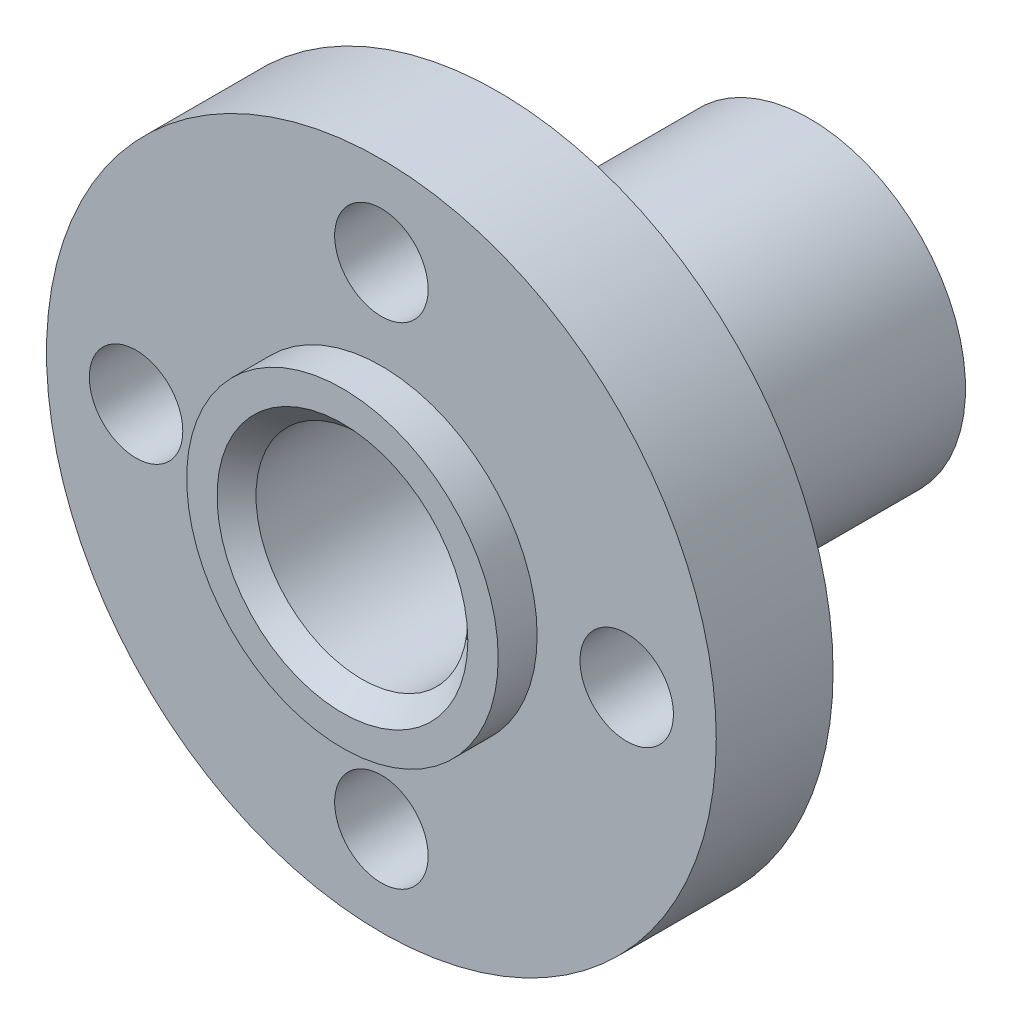
ISO-10303-21;
HEADER;
FILE_DESCRIPTION(('STEP AP214'),'2;1');
FILE_NAME('part.step','',(''),(''),'','','');
FILE_SCHEMA(('AUTOMOTIVE_DESIGN { 1 0 10303 214 1 1 1 1 }'));
ENDSEC;
DATA;
#1=APPLICATION_CONTEXT('core data for automotive mechanical design processes');
#2=APPLICATION_PROTOCOL_DEFINITION('international standard','automotive_design',2000,#1);
#3=PRODUCT_CONTEXT('',#1,'mechanical');
#4=PRODUCT('Part','Part','',(#3));
#5=PRODUCT_RELATED_PRODUCT_CATEGORY('part','',(#4));
#6=PRODUCT_DEFINITION_FORMATION('','',#4);
#7=PRODUCT_DEFINITION_CONTEXT('part definition',#1,'design');
#8=PRODUCT_DEFINITION('design','',#6,#7);
#9=PRODUCT_DEFINITION_SHAPE('','',#8);
#10=(LENGTH_UNIT() NAMED_UNIT(*) SI_UNIT(.MILLI.,.METRE.));
#11=(NAMED_UNIT(*) PLANE_ANGLE_UNIT() SI_UNIT($,.RADIAN.));
#12=(NAMED_UNIT(*) SI_UNIT($,.STERADIAN.) SOLID_ANGLE_UNIT());
#13=UNCERTAINTY_MEASURE_WITH_UNIT(LENGTH_MEASURE(1.E-05),#10,'distance_accuracy_value','');
#14=(GEOMETRIC_REPRESENTATION_CONTEXT(3) GLOBAL_UNCERTAINTY_ASSIGNED_CONTEXT((#13)) GLOBAL_UNIT_ASSIGNED_CONTEXT((#10,
#11,#12)) REPRESENTATION_CONTEXT('',''));
#15=CARTESIAN_POINT('',(0.,0.,0.));
#16=DIRECTION('',(0.,0.,1.));
#17=DIRECTION('',(1.,0.,0.));
#18=AXIS2_PLACEMENT_3D('',#15,#16,#17);
#19=CARTESIAN_POINT('',(0.,0.,-3.75));
#20=DIRECTION('',(0.,0.,1.));
#21=DIRECTION('',(1.,0.,0.));
#22=AXIS2_PLACEMENT_3D('',#19,#20,#21);
#23=CYLINDRICAL_SURFACE('',#22,10.75);
#24=CARTESIAN_POINT('',(0.,0.,-3.75));
#25=DIRECTION('',(0.,0.,1.));
#26=DIRECTION('',(1.,0.,0.));
#27=AXIS2_PLACEMENT_3D('',#24,#25,#26);
#28=CIRCLE('',#27,10.75);
#29=CARTESIAN_POINT('',(10.75,0.,-3.75));
#30=VERTEX_POINT('',#29);
#31=EDGE_CURVE('E55',#30,#30,#28,.T.);
#32=ORIENTED_EDGE('',*,*,#31,.T.);
#33=EDGE_LOOP('',(#32));
#34=FACE_BOUND('',#33,.T.);
#35=CARTESIAN_POINT('',(0.,0.,0.));
#36=DIRECTION('',(0.,0.,1.));
#37=DIRECTION('',(1.,0.,0.));
#38=AXIS2_PLACEMENT_3D('',#35,#36,#37);
#39=CIRCLE('',#38,10.75);
#40=CARTESIAN_POINT('',(10.75,0.,0.));
#41=VERTEX_POINT('',#40);
#42=EDGE_CURVE('E44',#41,#41,#39,.T.);
#43=ORIENTED_EDGE('',*,*,#42,.F.);
#44=EDGE_LOOP('',(#43));
#45=FACE_BOUND('',#44,.T.);
#46=ADVANCED_FACE('F41',(#34,#45),#23,.T.);
#47=CARTESIAN_POINT('',(0.,0.,-3.75));
#48=DIRECTION('',(0.,0.,1.));
#49=DIRECTION('',(1.,0.,0.));
#50=AXIS2_PLACEMENT_3D('',#47,#48,#49);
#51=PLANE('',#50);
#52=CARTESIAN_POINT('',(-7.875,0.,-3.75));
#53=DIRECTION('',(0.,0.,1.));
#54=DIRECTION('',(1.,0.,0.));
#55=AXIS2_PLACEMENT_3D('',#52,#53,#54);
#56=CIRCLE('',#55,1.5);
#57=CARTESIAN_POINT('',(-6.375,0.,-3.75));
#58=VERTEX_POINT('',#57);
#59=EDGE_CURVE('E131',#58,#58,#56,.F.);
#60=ORIENTED_EDGE('',*,*,#59,.F.);
#61=EDGE_LOOP('',(#60));
#62=FACE_BOUND('',#61,.T.);
#63=CARTESIAN_POINT('',(0.,7.875,-3.75));
#64=DIRECTION('',(0.,0.,1.));
#65=DIRECTION('',(1.,0.,0.));
#66=AXIS2_PLACEMENT_3D('',#63,#64,#65);
#67=CIRCLE('',#66,1.5);
#68=CARTESIAN_POINT('',(1.50000000000003,7.875,-3.75));
#69=VERTEX_POINT('',#68);
#70=EDGE_CURVE('E136',#69,#69,#67,.F.);
#71=ORIENTED_EDGE('',*,*,#70,.F.);
#72=EDGE_LOOP('',(#71));
#73=FACE_BOUND('',#72,.T.);
#74=CARTESIAN_POINT('',(7.875,0.,-3.75));
#75=DIRECTION('',(0.,0.,1.));
#76=DIRECTION('',(1.,0.,0.));
#77=AXIS2_PLACEMENT_3D('',#74,#75,#76);
#78=CIRCLE('',#77,1.5);
#79=CARTESIAN_POINT('',(9.375,0.,-3.75));
#80=VERTEX_POINT('',#79);
#81=EDGE_CURVE('E148',#80,#80,#78,.F.);
#82=ORIENTED_EDGE('',*,*,#81,.F.);
#83=EDGE_LOOP('',(#82));
#84=FACE_BOUND('',#83,.T.);
#85=CARTESIAN_POINT('',(0.,-7.875,-3.75));
#86=DIRECTION('',(0.,0.,1.));
#87=DIRECTION('',(1.,0.,0.));
#88=AXIS2_PLACEMENT_3D('',#85,#86,#87);
#89=CIRCLE('',#88,1.5);
#90=CARTESIAN_POINT('',(1.49999999999992,-7.875,-3.75));
#91=VERTEX_POINT('',#90);
#92=EDGE_CURVE('E154',#91,#91,#89,.F.);
#93=ORIENTED_EDGE('',*,*,#92,.F.);
#94=EDGE_LOOP('',(#93));
#95=FACE_BOUND('',#94,.T.);
#96=CARTESIAN_POINT('',(0.,0.,-3.75));
#97=DIRECTION('',(0.,0.,-1.));
#98=DIRECTION('',(-1.,0.,0.));
#99=AXIS2_PLACEMENT_3D('',#96,#97,#98);
#100=CIRCLE('',#99,5.);
#101=CARTESIAN_POINT('',(-5.,0.,-3.75));
#102=VERTEX_POINT('',#101);
#103=EDGE_CURVE('E49',#102,#102,#100,.T.);
#104=ORIENTED_EDGE('',*,*,#103,.F.);
#105=EDGE_LOOP('',(#104));
#106=FACE_BOUND('',#105,.T.);
#107=ORIENTED_EDGE('',*,*,#31,.F.);
#108=EDGE_LOOP('',(#107));
#109=FACE_BOUND('',#108,.T.);
#110=ADVANCED_FACE('F75',(#62,#73,#84,#95,#106,#109),#51,.F.);
#111=CARTESIAN_POINT('',(0.,0.,0.));
#112=DIRECTION('',(0.,0.,1.));
#113=DIRECTION('',(1.,0.,0.));
#114=AXIS2_PLACEMENT_3D('',#111,#112,#113);
#115=PLANE('',#114);
#116=CARTESIAN_POINT('',(-7.875,0.,0.));
#117=DIRECTION('',(0.,0.,1.));
#118=DIRECTION('',(1.,0.,0.));
#119=AXIS2_PLACEMENT_3D('',#116,#117,#118);
#120=CIRCLE('',#119,1.5);
#121=CARTESIAN_POINT('',(-6.375,0.,0.));
#122=VERTEX_POINT('',#121);
#123=EDGE_CURVE('E134',#122,#122,#120,.T.);
#124=ORIENTED_EDGE('',*,*,#123,.F.);
#125=EDGE_LOOP('',(#124));
#126=FACE_BOUND('',#125,.T.);
#127=CARTESIAN_POINT('',(0.,7.875,0.));
#128=DIRECTION('',(0.,0.,1.));
#129=DIRECTION('',(1.,0.,0.));
#130=AXIS2_PLACEMENT_3D('',#127,#128,#129);
#131=CIRCLE('',#130,1.5);
#132=CARTESIAN_POINT('',(1.50000000000003,7.875,0.));
#133=VERTEX_POINT('',#132);
#134=EDGE_CURVE('E143',#133,#133,#131,.T.);
#135=ORIENTED_EDGE('',*,*,#134,.F.);
#136=EDGE_LOOP('',(#135));
#137=FACE_BOUND('',#136,.T.);
#138=CARTESIAN_POINT('',(7.875,0.,0.));
#139=DIRECTION('',(0.,0.,1.));
#140=DIRECTION('',(1.,0.,0.));
#141=AXIS2_PLACEMENT_3D('',#138,#139,#140);
#142=CIRCLE('',#141,1.5);
#143=CARTESIAN_POINT('',(9.375,0.,0.));
#144=VERTEX_POINT('',#143);
#145=EDGE_CURVE('E150',#144,#144,#142,.T.);
#146=ORIENTED_EDGE('',*,*,#145,.F.);
#147=EDGE_LOOP('',(#146));
#148=FACE_BOUND('',#147,.T.);
#149=CARTESIAN_POINT('',(0.,-7.875,0.));
#150=DIRECTION('',(0.,0.,1.));
#151=DIRECTION('',(1.,0.,0.));
#152=AXIS2_PLACEMENT_3D('',#149,#150,#151);
#153=CIRCLE('',#152,1.5);
#154=CARTESIAN_POINT('',(1.49999999999992,-7.875,0.));
#155=VERTEX_POINT('',#154);
#156=EDGE_CURVE('E158',#155,#155,#153,.T.);
#157=ORIENTED_EDGE('',*,*,#156,.F.);
#158=EDGE_LOOP('',(#157));
#159=FACE_BOUND('',#158,.T.);
#160=CARTESIAN_POINT('',(0.,0.,0.));
#161=DIRECTION('',(0.,0.,1.));
#162=DIRECTION('',(1.,0.,0.));
#163=AXIS2_PLACEMENT_3D('',#160,#161,#162);
#164=CIRCLE('',#163,5.);
#165=CARTESIAN_POINT('',(5.,0.,0.));
#166=VERTEX_POINT('',#165);
#167=EDGE_CURVE('E10',#166,#166,#164,.T.);
#168=ORIENTED_EDGE('',*,*,#167,.F.);
#169=EDGE_LOOP('',(#168));
#170=FACE_BOUND('',#169,.T.);
#171=ORIENTED_EDGE('',*,*,#42,.T.);
#172=EDGE_LOOP('',(#171));
#173=FACE_BOUND('',#172,.T.);
#174=ADVANCED_FACE('F72',(#126,#137,#148,#159,#170,#173),#115,.T.);
#175=CARTESIAN_POINT('',(0.,0.,-13.75));
#176=DIRECTION('',(0.,0.,1.));
#177=DIRECTION('',(1.,0.,0.));
#178=AXIS2_PLACEMENT_3D('',#175,#176,#177);
#179=CYLINDRICAL_SURFACE('',#178,5.);
#180=CARTESIAN_POINT('',(0.,0.,-13.75));
#181=DIRECTION('',(0.,0.,-1.));
#182=DIRECTION('',(-1.,0.,0.));
#183=AXIS2_PLACEMENT_3D('',#180,#181,#182);
#184=CIRCLE('',#183,5.);
#185=CARTESIAN_POINT('',(-5.,0.,-13.75));
#186=VERTEX_POINT('',#185);
#187=EDGE_CURVE('E61',#186,#186,#184,.T.);
#188=ORIENTED_EDGE('',*,*,#187,.F.);
#189=EDGE_LOOP('',(#188));
#190=FACE_BOUND('',#189,.T.);
#191=ORIENTED_EDGE('',*,*,#103,.T.);
#192=EDGE_LOOP('',(#191));
#193=FACE_BOUND('',#192,.T.);
#194=ADVANCED_FACE('F84',(#190,#193),#179,.T.);
#195=CARTESIAN_POINT('',(0.,0.,-13.75));
#196=DIRECTION('',(0.,0.,-1.));
#197=DIRECTION('',(-1.,0.,0.));
#198=AXIS2_PLACEMENT_3D('',#195,#196,#197);
#199=PLANE('',#198);
#200=CARTESIAN_POINT('',(0.,0.,-13.75));
#201=DIRECTION('',(0.,0.,1.));
#202=DIRECTION('',(1.,0.,0.));
#203=AXIS2_PLACEMENT_3D('',#200,#201,#202);
#204=CIRCLE('',#203,3.39999999999998);
#205=CARTESIAN_POINT('',(3.39999999999998,0.,-13.75));
#206=VERTEX_POINT('',#205);
#207=EDGE_CURVE('E171',#206,#206,#204,.T.);
#208=ORIENTED_EDGE('',*,*,#207,.T.);
#209=EDGE_LOOP('',(#208));
#210=FACE_BOUND('',#209,.T.);
#211=ORIENTED_EDGE('',*,*,#187,.T.);
#212=EDGE_LOOP('',(#211));
#213=FACE_BOUND('',#212,.T.);
#214=ADVANCED_FACE('F91',(#210,#213),#199,.T.);
#215=CARTESIAN_POINT('',(0.,0.,1.25));
#216=DIRECTION('',(0.,0.,-1.));
#217=DIRECTION('',(-1.,0.,0.));
#218=AXIS2_PLACEMENT_3D('',#215,#216,#217);
#219=CYLINDRICAL_SURFACE('',#218,5.);
#220=CARTESIAN_POINT('',(0.,0.,1.25));
#221=DIRECTION('',(0.,0.,1.));
#222=DIRECTION('',(1.,0.,0.));
#223=AXIS2_PLACEMENT_3D('',#220,#221,#222);
#224=CIRCLE('',#223,5.);
#225=CARTESIAN_POINT('',(5.,0.,1.25));
#226=VERTEX_POINT('',#225);
#227=EDGE_CURVE('E59',#226,#226,#224,.T.);
#228=ORIENTED_EDGE('',*,*,#227,.F.);
#229=EDGE_LOOP('',(#228));
#230=FACE_BOUND('',#229,.T.);
#231=ORIENTED_EDGE('',*,*,#167,.T.);
#232=EDGE_LOOP('',(#231));
#233=FACE_BOUND('',#232,.T.);
#234=ADVANCED_FACE('F95',(#230,#233),#219,.T.);
#235=CARTESIAN_POINT('',(0.,0.,1.25));
#236=DIRECTION('',(0.,0.,1.));
#237=DIRECTION('',(1.,0.,0.));
#238=AXIS2_PLACEMENT_3D('',#235,#236,#237);
#239=PLANE('',#238);
#240=CARTESIAN_POINT('',(0.,0.,1.25));
#241=DIRECTION('',(0.,0.,1.));
#242=DIRECTION('',(1.,0.,0.));
#243=AXIS2_PLACEMENT_3D('',#240,#241,#242);
#244=CIRCLE('',#243,4.025);
#245=CARTESIAN_POINT('',(4.025,0.,1.25));
#246=VERTEX_POINT('',#245);
#247=EDGE_CURVE('E140',#246,#246,#244,.T.);
#248=ORIENTED_EDGE('',*,*,#247,.F.);
#249=EDGE_LOOP('',(#248));
#250=FACE_BOUND('',#249,.T.);
#251=ORIENTED_EDGE('',*,*,#227,.T.);
#252=EDGE_LOOP('',(#251));
#253=FACE_BOUND('',#252,.T.);
#254=ADVANCED_FACE('F99',(#250,#253),#239,.T.);
#255=CARTESIAN_POINT('',(0.,0.,1.25));
#256=DIRECTION('',(0.,0.,1.));
#257=DIRECTION('',(1.,0.,0.));
#258=AXIS2_PLACEMENT_3D('',#255,#256,#257);
#259=CYLINDRICAL_SURFACE('',#258,3.39999999999998);
#260=ORIENTED_EDGE('',*,*,#207,.F.);
#261=EDGE_LOOP('',(#260));
#262=FACE_BOUND('',#261,.T.);
#263=CARTESIAN_POINT('',(0.,0.,0.624999999999986));
#264=DIRECTION('',(0.,0.,1.));
#265=DIRECTION('',(1.,0.,0.));
#266=AXIS2_PLACEMENT_3D('',#263,#264,#265);
#267=CIRCLE('',#266,3.39999999999999);
#268=CARTESIAN_POINT('',(3.39999999999999,0.,0.624999999999986));
#269=VERTEX_POINT('',#268);
#270=EDGE_CURVE('E168',#269,#269,#267,.T.);
#271=ORIENTED_EDGE('',*,*,#270,.T.);
#272=EDGE_LOOP('',(#271));
#273=FACE_BOUND('',#272,.T.);
#274=ADVANCED_FACE('F103',(#262,#273),#259,.F.);
#275=CARTESIAN_POINT('',(0.,0.,1.25));
#276=DIRECTION('',(0.,0.,1.));
#277=DIRECTION('',(1.,0.,0.));
#278=AXIS2_PLACEMENT_3D('',#275,#276,#277);
#279=CONICAL_SURFACE('',#278,4.025,0.785398163397446);
#280=ORIENTED_EDGE('',*,*,#270,.F.);
#281=EDGE_LOOP('',(#280));
#282=FACE_BOUND('',#281,.T.);
#283=ORIENTED_EDGE('',*,*,#247,.T.);
#284=EDGE_LOOP('',(#283));
#285=FACE_BOUND('',#284,.T.);
#286=ADVANCED_FACE('F107',(#282,#285),#279,.F.);
#287=CARTESIAN_POINT('',(0.,-7.875,-7.99264068711928));
#288=DIRECTION('',(0.,0.,1.));
#289=DIRECTION('',(1.,0.,0.));
#290=AXIS2_PLACEMENT_3D('',#287,#288,#289);
#291=CYLINDRICAL_SURFACE('',#290,1.5);
#292=ORIENTED_EDGE('',*,*,#92,.T.);
#293=EDGE_LOOP('',(#292));
#294=FACE_BOUND('',#293,.T.);
#295=ORIENTED_EDGE('',*,*,#156,.T.);
#296=EDGE_LOOP('',(#295));
#297=FACE_BOUND('',#296,.T.);
#298=ADVANCED_FACE('F111',(#294,#297),#291,.F.);
#299=CARTESIAN_POINT('',(7.875,0.,-7.99264068711928));
#300=DIRECTION('',(0.,0.,1.));
#301=DIRECTION('',(1.,0.,0.));
#302=AXIS2_PLACEMENT_3D('',#299,#300,#301);
#303=CYLINDRICAL_SURFACE('',#302,1.5);
#304=ORIENTED_EDGE('',*,*,#81,.T.);
#305=EDGE_LOOP('',(#304));
#306=FACE_BOUND('',#305,.T.);
#307=ORIENTED_EDGE('',*,*,#145,.T.);
#308=EDGE_LOOP('',(#307));
#309=FACE_BOUND('',#308,.T.);
#310=ADVANCED_FACE('F115',(#306,#309),#303,.F.);
#311=CARTESIAN_POINT('',(0.,7.875,-7.99264068711928));
#312=DIRECTION('',(0.,0.,1.));
#313=DIRECTION('',(1.,0.,0.));
#314=AXIS2_PLACEMENT_3D('',#311,#312,#313);
#315=CYLINDRICAL_SURFACE('',#314,1.5);
#316=ORIENTED_EDGE('',*,*,#70,.T.);
#317=EDGE_LOOP('',(#316));
#318=FACE_BOUND('',#317,.T.);
#319=ORIENTED_EDGE('',*,*,#134,.T.);
#320=EDGE_LOOP('',(#319));
#321=FACE_BOUND('',#320,.T.);
#322=ADVANCED_FACE('F119',(#318,#321),#315,.F.);
#323=CARTESIAN_POINT('',(-7.875,0.,-7.99264068711928));
#324=DIRECTION('',(0.,0.,1.));
#325=DIRECTION('',(1.,0.,0.));
#326=AXIS2_PLACEMENT_3D('',#323,#324,#325);
#327=CYLINDRICAL_SURFACE('',#326,1.5);
#328=ORIENTED_EDGE('',*,*,#59,.T.);
#329=EDGE_LOOP('',(#328));
#330=FACE_BOUND('',#329,.T.);
#331=ORIENTED_EDGE('',*,*,#123,.T.);
#332=EDGE_LOOP('',(#331));
#333=FACE_BOUND('',#332,.T.);
#334=ADVANCED_FACE('F123',(#330,#333),#327,.F.);
#335=CLOSED_SHELL('',(#46,#110,#174,#194,#214,#234,#254,#274,#286,#298,#310,#322,#334));
#336=MANIFOLD_SOLID_BREP('B2',#335);
#337=ADVANCED_BREP_SHAPE_REPRESENTATION('',(#18,#336),#14);
#338=SHAPE_DEFINITION_REPRESENTATION(#9,#337);
ENDSEC;
END-ISO-10303-21;
